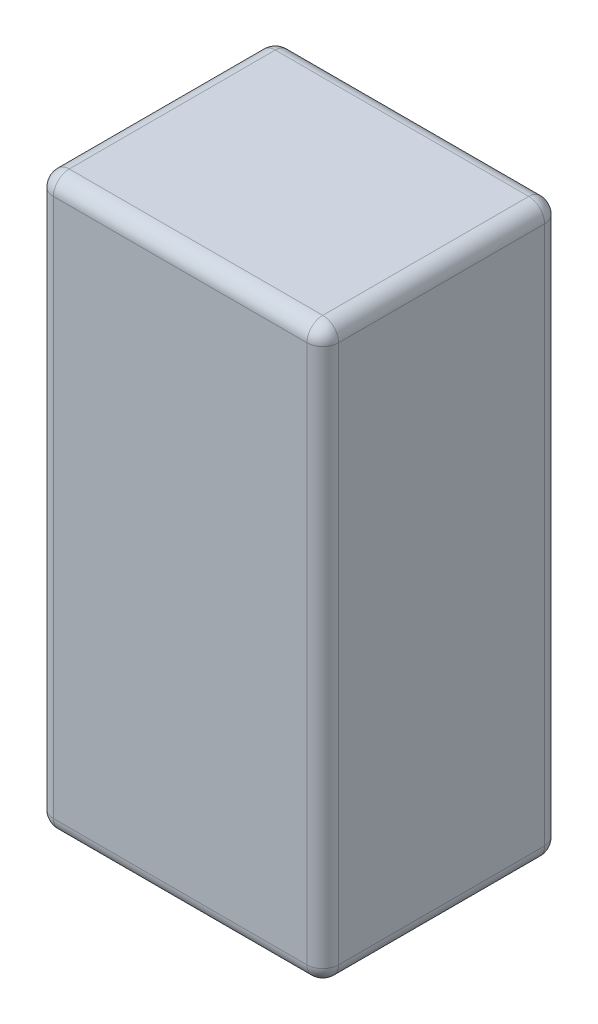
ISO-10303-21;
HEADER;
FILE_DESCRIPTION(('STEP AP214'),'2;1');
FILE_NAME('part.step','',(''),(''),'','','');
FILE_SCHEMA(('AUTOMOTIVE_DESIGN { 1 0 10303 214 1 1 1 1 }'));
ENDSEC;
DATA;
#1=APPLICATION_CONTEXT('core data for automotive mechanical design processes');
#2=APPLICATION_PROTOCOL_DEFINITION('international standard','automotive_design',2000,#1);
#3=PRODUCT_CONTEXT('',#1,'mechanical');
#4=PRODUCT('Part','Part','',(#3));
#5=PRODUCT_RELATED_PRODUCT_CATEGORY('part','',(#4));
#6=PRODUCT_DEFINITION_FORMATION('','',#4);
#7=PRODUCT_DEFINITION_CONTEXT('part definition',#1,'design');
#8=PRODUCT_DEFINITION('design','',#6,#7);
#9=PRODUCT_DEFINITION_SHAPE('','',#8);
#10=(LENGTH_UNIT() NAMED_UNIT(*) SI_UNIT(.MILLI.,.METRE.));
#11=(NAMED_UNIT(*) PLANE_ANGLE_UNIT() SI_UNIT($,.RADIAN.));
#12=(NAMED_UNIT(*) SI_UNIT($,.STERADIAN.) SOLID_ANGLE_UNIT());
#13=UNCERTAINTY_MEASURE_WITH_UNIT(LENGTH_MEASURE(1.E-05),#10,'distance_accuracy_value','');
#14=(GEOMETRIC_REPRESENTATION_CONTEXT(3) GLOBAL_UNCERTAINTY_ASSIGNED_CONTEXT((#13)) GLOBAL_UNIT_ASSIGNED_CONTEXT((#10,
#11,#12)) REPRESENTATION_CONTEXT('',''));
#15=CARTESIAN_POINT('',(0.,0.,0.));
#16=DIRECTION('',(0.,0.,1.));
#17=DIRECTION('',(1.,0.,0.));
#18=AXIS2_PLACEMENT_3D('',#15,#16,#17);
#19=CARTESIAN_POINT('',(-18.,72.,15.));
#20=DIRECTION('',(1.,0.,0.));
#21=DIRECTION('',(0.,0.,-1.));
#22=AXIS2_PLACEMENT_3D('',#19,#20,#21);
#23=PLANE('',#22);
#24=DIRECTION('',(0.,-1.,0.));
#25=VECTOR('',#24,1.);
#26=CARTESIAN_POINT('',(-18.,72.,-13.));
#27=LINE('',#26,#25);
#28=CARTESIAN_POINT('',(-18.,70.,-13.));
#29=VERTEX_POINT('',#28);
#30=CARTESIAN_POINT('',(-18.,2.,-13.));
#31=VERTEX_POINT('',#30);
#32=EDGE_CURVE('E135',#29,#31,#27,.T.);
#33=ORIENTED_EDGE('',*,*,#32,.T.);
#34=DIRECTION('',(0.,0.,1.));
#35=VECTOR('',#34,1.);
#36=CARTESIAN_POINT('',(-18.,2.,15.));
#37=LINE('',#36,#35);
#38=CARTESIAN_POINT('',(-18.,2.,13.));
#39=VERTEX_POINT('',#38);
#40=EDGE_CURVE('E131',#31,#39,#37,.T.);
#41=ORIENTED_EDGE('',*,*,#40,.T.);
#42=DIRECTION('',(0.,-1.,0.));
#43=VECTOR('',#42,1.);
#44=CARTESIAN_POINT('',(-18.,72.,13.));
#45=LINE('',#44,#43);
#46=CARTESIAN_POINT('',(-18.,70.,13.));
#47=VERTEX_POINT('',#46);
#48=EDGE_CURVE('E126',#39,#47,#45,.F.);
#49=ORIENTED_EDGE('',*,*,#48,.T.);
#50=DIRECTION('',(0.,0.,1.));
#51=VECTOR('',#50,1.);
#52=CARTESIAN_POINT('',(-18.,70.,-15.));
#53=LINE('',#52,#51);
#54=EDGE_CURVE('E128',#47,#29,#53,.F.);
#55=ORIENTED_EDGE('',*,*,#54,.T.);
#56=EDGE_LOOP('',(#33,#41,#49,#55));
#57=FACE_BOUND('',#56,.T.);
#58=ADVANCED_FACE('F38',(#57),#23,.F.);
#59=CARTESIAN_POINT('',(18.,72.,15.));
#60=DIRECTION('',(0.,0.,-1.));
#61=DIRECTION('',(-1.,0.,0.));
#62=AXIS2_PLACEMENT_3D('',#59,#60,#61);
#63=PLANE('',#62);
#64=DIRECTION('',(0.,-1.,0.));
#65=VECTOR('',#64,1.);
#66=CARTESIAN_POINT('',(-16.,72.,15.));
#67=LINE('',#66,#65);
#68=CARTESIAN_POINT('',(-16.,70.,15.));
#69=VERTEX_POINT('',#68);
#70=CARTESIAN_POINT('',(-16.,2.,15.));
#71=VERTEX_POINT('',#70);
#72=EDGE_CURVE('E157',#69,#71,#67,.T.);
#73=ORIENTED_EDGE('',*,*,#72,.T.);
#74=DIRECTION('',(1.,0.,0.));
#75=VECTOR('',#74,1.);
#76=CARTESIAN_POINT('',(18.,2.,15.));
#77=LINE('',#76,#75);
#78=CARTESIAN_POINT('',(16.,2.,15.));
#79=VERTEX_POINT('',#78);
#80=EDGE_CURVE('E235',#71,#79,#77,.T.);
#81=ORIENTED_EDGE('',*,*,#80,.T.);
#82=DIRECTION('',(0.,-1.,0.));
#83=VECTOR('',#82,1.);
#84=CARTESIAN_POINT('',(16.,72.,15.));
#85=LINE('',#84,#83);
#86=CARTESIAN_POINT('',(16.,70.,15.));
#87=VERTEX_POINT('',#86);
#88=EDGE_CURVE('E228',#79,#87,#85,.F.);
#89=ORIENTED_EDGE('',*,*,#88,.T.);
#90=DIRECTION('',(1.,0.,0.));
#91=VECTOR('',#90,1.);
#92=CARTESIAN_POINT('',(-18.,70.,15.));
#93=LINE('',#92,#91);
#94=EDGE_CURVE('E226',#87,#69,#93,.F.);
#95=ORIENTED_EDGE('',*,*,#94,.T.);
#96=EDGE_LOOP('',(#73,#81,#89,#95));
#97=FACE_BOUND('',#96,.T.);
#98=ADVANCED_FACE('F325',(#97),#63,.F.);
#99=CARTESIAN_POINT('',(18.,72.,15.));
#100=DIRECTION('',(-1.,0.,0.));
#101=DIRECTION('',(0.,0.,1.));
#102=AXIS2_PLACEMENT_3D('',#99,#100,#101);
#103=PLANE('',#102);
#104=DIRECTION('',(0.,0.,-1.));
#105=VECTOR('',#104,1.);
#106=CARTESIAN_POINT('',(18.,2.,15.));
#107=LINE('',#106,#105);
#108=CARTESIAN_POINT('',(18.,2.,13.));
#109=VERTEX_POINT('',#108);
#110=CARTESIAN_POINT('',(18.,2.,-13.));
#111=VERTEX_POINT('',#110);
#112=EDGE_CURVE('E222',#109,#111,#107,.T.);
#113=ORIENTED_EDGE('',*,*,#112,.T.);
#114=DIRECTION('',(0.,-1.,0.));
#115=VECTOR('',#114,1.);
#116=CARTESIAN_POINT('',(18.,72.,-13.));
#117=LINE('',#116,#115);
#118=CARTESIAN_POINT('',(18.,70.,-13.));
#119=VERTEX_POINT('',#118);
#120=EDGE_CURVE('E219',#111,#119,#117,.F.);
#121=ORIENTED_EDGE('',*,*,#120,.T.);
#122=DIRECTION('',(0.,0.,-1.));
#123=VECTOR('',#122,1.);
#124=CARTESIAN_POINT('',(18.,70.,15.));
#125=LINE('',#124,#123);
#126=CARTESIAN_POINT('',(18.,70.,13.));
#127=VERTEX_POINT('',#126);
#128=EDGE_CURVE('E212',#119,#127,#125,.F.);
#129=ORIENTED_EDGE('',*,*,#128,.T.);
#130=DIRECTION('',(0.,-1.,0.));
#131=VECTOR('',#130,1.);
#132=CARTESIAN_POINT('',(18.,72.,13.));
#133=LINE('',#132,#131);
#134=EDGE_CURVE('E215',#127,#109,#133,.T.);
#135=ORIENTED_EDGE('',*,*,#134,.T.);
#136=EDGE_LOOP('',(#113,#121,#129,#135));
#137=FACE_BOUND('',#136,.T.);
#138=ADVANCED_FACE('F220',(#137),#103,.F.);
#139=CARTESIAN_POINT('',(18.,72.,-15.));
#140=DIRECTION('',(0.,0.,1.));
#141=DIRECTION('',(1.,0.,0.));
#142=AXIS2_PLACEMENT_3D('',#139,#140,#141);
#143=PLANE('',#142);
#144=DIRECTION('',(-1.,0.,0.));
#145=VECTOR('',#144,1.);
#146=CARTESIAN_POINT('',(18.,2.,-15.));
#147=LINE('',#146,#145);
#148=CARTESIAN_POINT('',(16.,2.,-15.));
#149=VERTEX_POINT('',#148);
#150=CARTESIAN_POINT('',(-16.,2.,-15.));
#151=VERTEX_POINT('',#150);
#152=EDGE_CURVE('E284',#149,#151,#147,.T.);
#153=ORIENTED_EDGE('',*,*,#152,.T.);
#154=DIRECTION('',(0.,-1.,0.));
#155=VECTOR('',#154,1.);
#156=CARTESIAN_POINT('',(-16.,72.,-15.));
#157=LINE('',#156,#155);
#158=CARTESIAN_POINT('',(-16.,70.,-15.));
#159=VERTEX_POINT('',#158);
#160=EDGE_CURVE('E216',#151,#159,#157,.F.);
#161=ORIENTED_EDGE('',*,*,#160,.T.);
#162=DIRECTION('',(-1.,0.,0.));
#163=VECTOR('',#162,1.);
#164=CARTESIAN_POINT('',(18.,70.,-15.));
#165=LINE('',#164,#163);
#166=CARTESIAN_POINT('',(16.,70.,-15.));
#167=VERTEX_POINT('',#166);
#168=EDGE_CURVE('E277',#159,#167,#165,.F.);
#169=ORIENTED_EDGE('',*,*,#168,.T.);
#170=DIRECTION('',(0.,-1.,0.));
#171=VECTOR('',#170,1.);
#172=CARTESIAN_POINT('',(16.,72.,-15.));
#173=LINE('',#172,#171);
#174=EDGE_CURVE('E279',#167,#149,#173,.T.);
#175=ORIENTED_EDGE('',*,*,#174,.T.);
#176=EDGE_LOOP('',(#153,#161,#169,#175));
#177=FACE_BOUND('',#176,.T.);
#178=ADVANCED_FACE('F309',(#177),#143,.F.);
#179=CARTESIAN_POINT('',(0.,72.,0.));
#180=DIRECTION('',(0.,1.,0.));
#181=DIRECTION('',(0.,0.,1.));
#182=AXIS2_PLACEMENT_3D('',#179,#180,#181);
#183=PLANE('',#182);
#184=DIRECTION('',(0.,0.,-1.));
#185=VECTOR('',#184,1.);
#186=CARTESIAN_POINT('',(16.,72.,-15.));
#187=LINE('',#186,#185);
#188=CARTESIAN_POINT('',(16.,72.,13.));
#189=VERTEX_POINT('',#188);
#190=CARTESIAN_POINT('',(16.,72.,-13.));
#191=VERTEX_POINT('',#190);
#192=EDGE_CURVE('E47',#189,#191,#187,.T.);
#193=ORIENTED_EDGE('',*,*,#192,.T.);
#194=DIRECTION('',(-1.,0.,0.));
#195=VECTOR('',#194,1.);
#196=CARTESIAN_POINT('',(-18.,72.,-13.));
#197=LINE('',#196,#195);
#198=CARTESIAN_POINT('',(-16.,72.,-13.));
#199=VERTEX_POINT('',#198);
#200=EDGE_CURVE('E11',#191,#199,#197,.T.);
#201=ORIENTED_EDGE('',*,*,#200,.T.);
#202=DIRECTION('',(0.,0.,1.));
#203=VECTOR('',#202,1.);
#204=CARTESIAN_POINT('',(-16.,72.,15.));
#205=LINE('',#204,#203);
#206=CARTESIAN_POINT('',(-16.,72.,13.));
#207=VERTEX_POINT('',#206);
#208=EDGE_CURVE('E237',#199,#207,#205,.T.);
#209=ORIENTED_EDGE('',*,*,#208,.T.);
#210=DIRECTION('',(1.,0.,0.));
#211=VECTOR('',#210,1.);
#212=CARTESIAN_POINT('',(18.,72.,13.));
#213=LINE('',#212,#211);
#214=EDGE_CURVE('E58',#207,#189,#213,.T.);
#215=ORIENTED_EDGE('',*,*,#214,.T.);
#216=EDGE_LOOP('',(#193,#201,#209,#215));
#217=FACE_BOUND('',#216,.T.);
#218=ADVANCED_FACE('F531',(#217),#183,.T.);
#219=CARTESIAN_POINT('',(0.,0.,0.));
#220=DIRECTION('',(0.,1.,0.));
#221=DIRECTION('',(0.,0.,1.));
#222=AXIS2_PLACEMENT_3D('',#219,#220,#221);
#223=PLANE('',#222);
#224=DIRECTION('',(1.,0.,0.));
#225=VECTOR('',#224,1.);
#226=CARTESIAN_POINT('',(0.,0.,13.));
#227=LINE('',#226,#225);
#228=CARTESIAN_POINT('',(16.,0.,13.));
#229=VERTEX_POINT('',#228);
#230=CARTESIAN_POINT('',(-16.,0.,13.));
#231=VERTEX_POINT('',#230);
#232=EDGE_CURVE('E273',#229,#231,#227,.F.);
#233=ORIENTED_EDGE('',*,*,#232,.T.);
#234=DIRECTION('',(0.,0.,1.));
#235=VECTOR('',#234,1.);
#236=CARTESIAN_POINT('',(-16.,0.,0.));
#237=LINE('',#236,#235);
#238=CARTESIAN_POINT('',(-16.,0.,-13.));
#239=VERTEX_POINT('',#238);
#240=EDGE_CURVE('E267',#231,#239,#237,.F.);
#241=ORIENTED_EDGE('',*,*,#240,.T.);
#242=DIRECTION('',(-1.,0.,0.));
#243=VECTOR('',#242,1.);
#244=CARTESIAN_POINT('',(0.,0.,-13.));
#245=LINE('',#244,#243);
#246=CARTESIAN_POINT('',(16.,0.,-13.));
#247=VERTEX_POINT('',#246);
#248=EDGE_CURVE('E261',#239,#247,#245,.F.);
#249=ORIENTED_EDGE('',*,*,#248,.T.);
#250=DIRECTION('',(0.,0.,-1.));
#251=VECTOR('',#250,1.);
#252=CARTESIAN_POINT('',(16.,0.,0.));
#253=LINE('',#252,#251);
#254=EDGE_CURVE('E268',#247,#229,#253,.F.);
#255=ORIENTED_EDGE('',*,*,#254,.T.);
#256=EDGE_LOOP('',(#233,#241,#249,#255));
#257=FACE_BOUND('',#256,.T.);
#258=ADVANCED_FACE('F271',(#257),#223,.F.);
#259=CARTESIAN_POINT('',(16.,70.,0.));
#260=DIRECTION('',(0.,0.,1.));
#261=DIRECTION('',(1.,0.,0.));
#262=AXIS2_PLACEMENT_3D('',#259,#260,#261);
#263=CYLINDRICAL_SURFACE('',#262,2.);
#264=CARTESIAN_POINT('',(16.,70.,-13.));
#265=DIRECTION('',(0.,0.,-1.));
#266=DIRECTION('',(-1.,0.,0.));
#267=AXIS2_PLACEMENT_3D('',#264,#265,#266);
#268=CIRCLE('',#267,2.);
#269=EDGE_CURVE('E42',#191,#119,#268,.T.);
#270=ORIENTED_EDGE('',*,*,#269,.F.);
#271=ORIENTED_EDGE('',*,*,#192,.F.);
#272=CARTESIAN_POINT('',(16.,70.,13.));
#273=DIRECTION('',(0.,0.,1.));
#274=DIRECTION('',(1.,0.,0.));
#275=AXIS2_PLACEMENT_3D('',#272,#273,#274);
#276=CIRCLE('',#275,2.);
#277=EDGE_CURVE('E197',#127,#189,#276,.T.);
#278=ORIENTED_EDGE('',*,*,#277,.F.);
#279=ORIENTED_EDGE('',*,*,#128,.F.);
#280=EDGE_LOOP('',(#270,#271,#278,#279));
#281=FACE_BOUND('',#280,.T.);
#282=ADVANCED_FACE('F40',(#281),#263,.T.);
#283=CARTESIAN_POINT('',(16.,70.,-13.));
#284=DIRECTION('',(0.,0.,1.));
#285=DIRECTION('',(1.,0.,0.));
#286=AXIS2_PLACEMENT_3D('',#283,#284,#285);
#287=SPHERICAL_SURFACE('',#286,2.);
#288=CARTESIAN_POINT('',(16.,70.,-13.));
#289=DIRECTION('',(1.,0.,0.));
#290=DIRECTION('',(0.,0.,-1.));
#291=AXIS2_PLACEMENT_3D('',#288,#289,#290);
#292=CIRCLE('',#291,2.);
#293=EDGE_CURVE('E193',#191,#167,#292,.F.);
#294=ORIENTED_EDGE('',*,*,#293,.F.);
#295=ORIENTED_EDGE('',*,*,#269,.T.);
#296=CARTESIAN_POINT('',(16.,70.,-13.));
#297=DIRECTION('',(0.,1.,0.));
#298=DIRECTION('',(0.,0.,1.));
#299=AXIS2_PLACEMENT_3D('',#296,#297,#298);
#300=CIRCLE('',#299,2.);
#301=EDGE_CURVE('E196',#167,#119,#300,.F.);
#302=ORIENTED_EDGE('',*,*,#301,.F.);
#303=EDGE_LOOP('',(#294,#295,#302));
#304=FACE_BOUND('',#303,.T.);
#305=ADVANCED_FACE('F208',(#304),#287,.T.);
#306=CARTESIAN_POINT('',(16.,70.,13.));
#307=DIRECTION('',(0.,0.,1.));
#308=DIRECTION('',(1.,0.,0.));
#309=AXIS2_PLACEMENT_3D('',#306,#307,#308);
#310=SPHERICAL_SURFACE('',#309,2.);
#311=CARTESIAN_POINT('',(16.,70.,13.));
#312=DIRECTION('',(0.,1.,0.));
#313=DIRECTION('',(0.,0.,1.));
#314=AXIS2_PLACEMENT_3D('',#311,#312,#313);
#315=CIRCLE('',#314,2.);
#316=EDGE_CURVE('E187',#127,#87,#315,.F.);
#317=ORIENTED_EDGE('',*,*,#316,.F.);
#318=ORIENTED_EDGE('',*,*,#277,.T.);
#319=CARTESIAN_POINT('',(16.,70.,13.));
#320=DIRECTION('',(1.,0.,0.));
#321=DIRECTION('',(0.,0.,-1.));
#322=AXIS2_PLACEMENT_3D('',#319,#320,#321);
#323=CIRCLE('',#322,2.);
#324=EDGE_CURVE('E190',#87,#189,#323,.F.);
#325=ORIENTED_EDGE('',*,*,#324,.F.);
#326=EDGE_LOOP('',(#317,#318,#325));
#327=FACE_BOUND('',#326,.T.);
#328=ADVANCED_FACE('F498',(#327),#310,.T.);
#329=CARTESIAN_POINT('',(16.,72.,-13.));
#330=DIRECTION('',(0.,-1.,0.));
#331=DIRECTION('',(0.,0.,-1.));
#332=AXIS2_PLACEMENT_3D('',#329,#330,#331);
#333=CYLINDRICAL_SURFACE('',#332,2.);
#334=ORIENTED_EDGE('',*,*,#301,.T.);
#335=ORIENTED_EDGE('',*,*,#120,.F.);
#336=CARTESIAN_POINT('',(16.,2.,-13.));
#337=DIRECTION('',(0.,-1.,0.));
#338=DIRECTION('',(0.,0.,-1.));
#339=AXIS2_PLACEMENT_3D('',#336,#337,#338);
#340=CIRCLE('',#339,2.);
#341=EDGE_CURVE('E181',#149,#111,#340,.T.);
#342=ORIENTED_EDGE('',*,*,#341,.F.);
#343=ORIENTED_EDGE('',*,*,#174,.F.);
#344=EDGE_LOOP('',(#334,#335,#342,#343));
#345=FACE_BOUND('',#344,.T.);
#346=ADVANCED_FACE('F311',(#345),#333,.T.);
#347=CARTESIAN_POINT('',(0.,70.,-13.));
#348=DIRECTION('',(1.,0.,0.));
#349=DIRECTION('',(0.,0.,-1.));
#350=AXIS2_PLACEMENT_3D('',#347,#348,#349);
#351=CYLINDRICAL_SURFACE('',#350,2.);
#352=ORIENTED_EDGE('',*,*,#293,.T.);
#353=ORIENTED_EDGE('',*,*,#168,.F.);
#354=CARTESIAN_POINT('',(-16.,70.,-13.));
#355=DIRECTION('',(-1.,0.,0.));
#356=DIRECTION('',(0.,0.,1.));
#357=AXIS2_PLACEMENT_3D('',#354,#355,#356);
#358=CIRCLE('',#357,2.);
#359=EDGE_CURVE('E178',#199,#159,#358,.T.);
#360=ORIENTED_EDGE('',*,*,#359,.F.);
#361=ORIENTED_EDGE('',*,*,#200,.F.);
#362=EDGE_LOOP('',(#352,#353,#360,#361));
#363=FACE_BOUND('',#362,.T.);
#364=ADVANCED_FACE('F476',(#363),#351,.T.);
#365=CARTESIAN_POINT('',(-16.,70.,0.));
#366=DIRECTION('',(0.,0.,-1.));
#367=DIRECTION('',(-1.,0.,0.));
#368=AXIS2_PLACEMENT_3D('',#365,#366,#367);
#369=CYLINDRICAL_SURFACE('',#368,2.);
#370=CARTESIAN_POINT('',(-16.,70.,13.));
#371=DIRECTION('',(0.,0.,1.));
#372=DIRECTION('',(1.,0.,0.));
#373=AXIS2_PLACEMENT_3D('',#370,#371,#372);
#374=CIRCLE('',#373,2.);
#375=EDGE_CURVE('E142',#207,#47,#374,.T.);
#376=ORIENTED_EDGE('',*,*,#375,.F.);
#377=ORIENTED_EDGE('',*,*,#208,.F.);
#378=CARTESIAN_POINT('',(-16.,70.,-13.));
#379=DIRECTION('',(0.,0.,-1.));
#380=DIRECTION('',(-1.,0.,0.));
#381=AXIS2_PLACEMENT_3D('',#378,#379,#380);
#382=CIRCLE('',#381,2.);
#383=EDGE_CURVE('E144',#29,#199,#382,.T.);
#384=ORIENTED_EDGE('',*,*,#383,.F.);
#385=ORIENTED_EDGE('',*,*,#54,.F.);
#386=EDGE_LOOP('',(#376,#377,#384,#385));
#387=FACE_BOUND('',#386,.T.);
#388=ADVANCED_FACE('F140',(#387),#369,.T.);
#389=CARTESIAN_POINT('',(0.,70.,13.));
#390=DIRECTION('',(-1.,0.,0.));
#391=DIRECTION('',(0.,0.,1.));
#392=AXIS2_PLACEMENT_3D('',#389,#390,#391);
#393=CYLINDRICAL_SURFACE('',#392,2.);
#394=ORIENTED_EDGE('',*,*,#324,.T.);
#395=ORIENTED_EDGE('',*,*,#214,.F.);
#396=CARTESIAN_POINT('',(-16.,70.,13.));
#397=DIRECTION('',(-1.,0.,0.));
#398=DIRECTION('',(0.,-1.,0.));
#399=AXIS2_PLACEMENT_3D('',#396,#397,#398);
#400=CIRCLE('',#399,2.);
#401=EDGE_CURVE('E153',#69,#207,#400,.T.);
#402=ORIENTED_EDGE('',*,*,#401,.F.);
#403=ORIENTED_EDGE('',*,*,#94,.F.);
#404=EDGE_LOOP('',(#394,#395,#402,#403));
#405=FACE_BOUND('',#404,.T.);
#406=ADVANCED_FACE('F457',(#405),#393,.T.);
#407=CARTESIAN_POINT('',(16.,72.,13.));
#408=DIRECTION('',(0.,-1.,0.));
#409=DIRECTION('',(0.,0.,-1.));
#410=AXIS2_PLACEMENT_3D('',#407,#408,#409);
#411=CYLINDRICAL_SURFACE('',#410,2.);
#412=ORIENTED_EDGE('',*,*,#316,.T.);
#413=ORIENTED_EDGE('',*,*,#88,.F.);
#414=CARTESIAN_POINT('',(16.,2.,13.));
#415=DIRECTION('',(0.,-1.,0.));
#416=DIRECTION('',(0.,0.,-1.));
#417=AXIS2_PLACEMENT_3D('',#414,#415,#416);
#418=CIRCLE('',#417,2.);
#419=EDGE_CURVE('E173',#109,#79,#418,.T.);
#420=ORIENTED_EDGE('',*,*,#419,.F.);
#421=ORIENTED_EDGE('',*,*,#134,.F.);
#422=EDGE_LOOP('',(#412,#413,#420,#421));
#423=FACE_BOUND('',#422,.T.);
#424=ADVANCED_FACE('F295',(#423),#411,.T.);
#425=CARTESIAN_POINT('',(16.,2.,15.));
#426=DIRECTION('',(0.,0.,-1.));
#427=DIRECTION('',(-1.,0.,0.));
#428=AXIS2_PLACEMENT_3D('',#425,#426,#427);
#429=CYLINDRICAL_SURFACE('',#428,2.);
#430=CARTESIAN_POINT('',(16.,2.,-13.));
#431=DIRECTION('',(0.,0.,-1.));
#432=DIRECTION('',(-1.,0.,0.));
#433=AXIS2_PLACEMENT_3D('',#430,#431,#432);
#434=CIRCLE('',#433,2.);
#435=EDGE_CURVE('E184',#111,#247,#434,.T.);
#436=ORIENTED_EDGE('',*,*,#435,.F.);
#437=ORIENTED_EDGE('',*,*,#112,.F.);
#438=CARTESIAN_POINT('',(16.,2.,13.));
#439=DIRECTION('',(0.,0.,1.));
#440=DIRECTION('',(1.,0.,0.));
#441=AXIS2_PLACEMENT_3D('',#438,#439,#440);
#442=CIRCLE('',#441,2.);
#443=EDGE_CURVE('E170',#229,#109,#442,.T.);
#444=ORIENTED_EDGE('',*,*,#443,.F.);
#445=ORIENTED_EDGE('',*,*,#254,.F.);
#446=EDGE_LOOP('',(#436,#437,#444,#445));
#447=FACE_BOUND('',#446,.T.);
#448=ADVANCED_FACE('F292',(#447),#429,.T.);
#449=CARTESIAN_POINT('',(16.,2.,-13.));
#450=DIRECTION('',(0.,0.,1.));
#451=DIRECTION('',(1.,0.,0.));
#452=AXIS2_PLACEMENT_3D('',#449,#450,#451);
#453=SPHERICAL_SURFACE('',#452,2.);
#454=ORIENTED_EDGE('',*,*,#341,.T.);
#455=ORIENTED_EDGE('',*,*,#435,.T.);
#456=CARTESIAN_POINT('',(16.,2.,-13.));
#457=DIRECTION('',(1.,0.,0.));
#458=DIRECTION('',(0.,0.,-1.));
#459=AXIS2_PLACEMENT_3D('',#456,#457,#458);
#460=CIRCLE('',#459,2.);
#461=EDGE_CURVE('E161',#149,#247,#460,.F.);
#462=ORIENTED_EDGE('',*,*,#461,.F.);
#463=EDGE_LOOP('',(#454,#455,#462));
#464=FACE_BOUND('',#463,.T.);
#465=ADVANCED_FACE('F313',(#464),#453,.T.);
#466=CARTESIAN_POINT('',(-16.,70.,-13.));
#467=DIRECTION('',(0.,0.,1.));
#468=DIRECTION('',(1.,0.,0.));
#469=AXIS2_PLACEMENT_3D('',#466,#467,#468);
#470=SPHERICAL_SURFACE('',#469,2.);
#471=ORIENTED_EDGE('',*,*,#383,.T.);
#472=ORIENTED_EDGE('',*,*,#359,.T.);
#473=CARTESIAN_POINT('',(-16.,70.,-13.));
#474=DIRECTION('',(0.,1.,0.));
#475=DIRECTION('',(0.,0.,1.));
#476=AXIS2_PLACEMENT_3D('',#473,#474,#475);
#477=CIRCLE('',#476,2.);
#478=EDGE_CURVE('E158',#29,#159,#477,.F.);
#479=ORIENTED_EDGE('',*,*,#478,.F.);
#480=EDGE_LOOP('',(#471,#472,#479));
#481=FACE_BOUND('',#480,.T.);
#482=ADVANCED_FACE('F315',(#481),#470,.T.);
#483=CARTESIAN_POINT('',(-16.,70.,13.));
#484=DIRECTION('',(0.,0.,1.));
#485=DIRECTION('',(1.,0.,0.));
#486=AXIS2_PLACEMENT_3D('',#483,#484,#485);
#487=SPHERICAL_SURFACE('',#486,2.);
#488=ORIENTED_EDGE('',*,*,#401,.T.);
#489=ORIENTED_EDGE('',*,*,#375,.T.);
#490=CARTESIAN_POINT('',(-16.,70.,13.));
#491=DIRECTION('',(0.,1.,0.));
#492=DIRECTION('',(0.,0.,1.));
#493=AXIS2_PLACEMENT_3D('',#490,#491,#492);
#494=CIRCLE('',#493,2.);
#495=EDGE_CURVE('E150',#69,#47,#494,.F.);
#496=ORIENTED_EDGE('',*,*,#495,.F.);
#497=EDGE_LOOP('',(#488,#489,#496));
#498=FACE_BOUND('',#497,.T.);
#499=ADVANCED_FACE('F149',(#498),#487,.T.);
#500=CARTESIAN_POINT('',(16.,2.,13.));
#501=DIRECTION('',(0.,0.,1.));
#502=DIRECTION('',(1.,0.,0.));
#503=AXIS2_PLACEMENT_3D('',#500,#501,#502);
#504=SPHERICAL_SURFACE('',#503,2.);
#505=ORIENTED_EDGE('',*,*,#443,.T.);
#506=ORIENTED_EDGE('',*,*,#419,.T.);
#507=CARTESIAN_POINT('',(16.,2.,13.));
#508=DIRECTION('',(1.,0.,0.));
#509=DIRECTION('',(0.,0.,-1.));
#510=AXIS2_PLACEMENT_3D('',#507,#508,#509);
#511=CIRCLE('',#510,2.);
#512=EDGE_CURVE('E159',#229,#79,#511,.F.);
#513=ORIENTED_EDGE('',*,*,#512,.F.);
#514=EDGE_LOOP('',(#505,#506,#513));
#515=FACE_BOUND('',#514,.T.);
#516=ADVANCED_FACE('F297',(#515),#504,.T.);
#517=CARTESIAN_POINT('',(18.,2.,-13.));
#518=DIRECTION('',(-1.,0.,0.));
#519=DIRECTION('',(0.,0.,1.));
#520=AXIS2_PLACEMENT_3D('',#517,#518,#519);
#521=CYLINDRICAL_SURFACE('',#520,2.);
#522=ORIENTED_EDGE('',*,*,#461,.T.);
#523=ORIENTED_EDGE('',*,*,#248,.F.);
#524=CARTESIAN_POINT('',(-16.,2.,-13.));
#525=DIRECTION('',(-1.,0.,0.));
#526=DIRECTION('',(0.,0.,1.));
#527=AXIS2_PLACEMENT_3D('',#524,#525,#526);
#528=CIRCLE('',#527,2.);
#529=EDGE_CURVE('E164',#151,#239,#528,.T.);
#530=ORIENTED_EDGE('',*,*,#529,.F.);
#531=ORIENTED_EDGE('',*,*,#152,.F.);
#532=EDGE_LOOP('',(#522,#523,#530,#531));
#533=FACE_BOUND('',#532,.T.);
#534=ADVANCED_FACE('F263',(#533),#521,.T.);
#535=CARTESIAN_POINT('',(-16.,72.,-13.));
#536=DIRECTION('',(0.,-1.,0.));
#537=DIRECTION('',(0.,0.,-1.));
#538=AXIS2_PLACEMENT_3D('',#535,#536,#537);
#539=CYLINDRICAL_SURFACE('',#538,2.);
#540=ORIENTED_EDGE('',*,*,#478,.T.);
#541=ORIENTED_EDGE('',*,*,#160,.F.);
#542=CARTESIAN_POINT('',(-16.,2.,-13.));
#543=DIRECTION('',(0.,-1.,0.));
#544=DIRECTION('',(0.,0.,-1.));
#545=AXIS2_PLACEMENT_3D('',#542,#543,#544);
#546=CIRCLE('',#545,2.);
#547=EDGE_CURVE('E250',#31,#151,#546,.T.);
#548=ORIENTED_EDGE('',*,*,#547,.F.);
#549=ORIENTED_EDGE('',*,*,#32,.F.);
#550=EDGE_LOOP('',(#540,#541,#548,#549));
#551=FACE_BOUND('',#550,.T.);
#552=ADVANCED_FACE('F307',(#551),#539,.T.);
#553=CARTESIAN_POINT('',(-16.,72.,13.));
#554=DIRECTION('',(0.,-1.,0.));
#555=DIRECTION('',(0.,0.,-1.));
#556=AXIS2_PLACEMENT_3D('',#553,#554,#555);
#557=CYLINDRICAL_SURFACE('',#556,2.);
#558=ORIENTED_EDGE('',*,*,#495,.T.);
#559=ORIENTED_EDGE('',*,*,#48,.F.);
#560=CARTESIAN_POINT('',(-16.,2.,13.));
#561=DIRECTION('',(0.,-1.,0.));
#562=DIRECTION('',(0.,0.,-1.));
#563=AXIS2_PLACEMENT_3D('',#560,#561,#562);
#564=CIRCLE('',#563,2.);
#565=EDGE_CURVE('E247',#71,#39,#564,.T.);
#566=ORIENTED_EDGE('',*,*,#565,.F.);
#567=ORIENTED_EDGE('',*,*,#72,.F.);
#568=EDGE_LOOP('',(#558,#559,#566,#567));
#569=FACE_BOUND('',#568,.T.);
#570=ADVANCED_FACE('F155',(#569),#557,.T.);
#571=CARTESIAN_POINT('',(18.,2.,13.));
#572=DIRECTION('',(1.,0.,0.));
#573=DIRECTION('',(0.,0.,-1.));
#574=AXIS2_PLACEMENT_3D('',#571,#572,#573);
#575=CYLINDRICAL_SURFACE('',#574,2.);
#576=ORIENTED_EDGE('',*,*,#512,.T.);
#577=ORIENTED_EDGE('',*,*,#80,.F.);
#578=CARTESIAN_POINT('',(-16.,2.,13.));
#579=DIRECTION('',(-1.,0.,0.));
#580=DIRECTION('',(0.,0.,1.));
#581=AXIS2_PLACEMENT_3D('',#578,#579,#580);
#582=CIRCLE('',#581,2.);
#583=EDGE_CURVE('E245',#231,#71,#582,.T.);
#584=ORIENTED_EDGE('',*,*,#583,.F.);
#585=ORIENTED_EDGE('',*,*,#232,.F.);
#586=EDGE_LOOP('',(#576,#577,#584,#585));
#587=FACE_BOUND('',#586,.T.);
#588=ADVANCED_FACE('F300',(#587),#575,.T.);
#589=CARTESIAN_POINT('',(-16.,2.,-13.));
#590=DIRECTION('',(0.,0.,1.));
#591=DIRECTION('',(1.,0.,0.));
#592=AXIS2_PLACEMENT_3D('',#589,#590,#591);
#593=SPHERICAL_SURFACE('',#592,2.);
#594=ORIENTED_EDGE('',*,*,#547,.T.);
#595=ORIENTED_EDGE('',*,*,#529,.T.);
#596=CARTESIAN_POINT('',(-16.,2.,-13.));
#597=DIRECTION('',(0.,0.,-1.));
#598=DIRECTION('',(-1.,0.,0.));
#599=AXIS2_PLACEMENT_3D('',#596,#597,#598);
#600=CIRCLE('',#599,2.);
#601=EDGE_CURVE('E243',#31,#239,#600,.F.);
#602=ORIENTED_EDGE('',*,*,#601,.F.);
#603=EDGE_LOOP('',(#594,#595,#602));
#604=FACE_BOUND('',#603,.T.);
#605=ADVANCED_FACE('F257',(#604),#593,.T.);
#606=CARTESIAN_POINT('',(-16.,2.,13.));
#607=DIRECTION('',(0.,0.,1.));
#608=DIRECTION('',(1.,0.,0.));
#609=AXIS2_PLACEMENT_3D('',#606,#607,#608);
#610=SPHERICAL_SURFACE('',#609,2.);
#611=ORIENTED_EDGE('',*,*,#583,.T.);
#612=ORIENTED_EDGE('',*,*,#565,.T.);
#613=CARTESIAN_POINT('',(-16.,2.,13.));
#614=DIRECTION('',(0.,0.,1.));
#615=DIRECTION('',(1.,0.,0.));
#616=AXIS2_PLACEMENT_3D('',#613,#614,#615);
#617=CIRCLE('',#616,2.);
#618=EDGE_CURVE('E241',#231,#39,#617,.F.);
#619=ORIENTED_EDGE('',*,*,#618,.F.);
#620=EDGE_LOOP('',(#611,#612,#619));
#621=FACE_BOUND('',#620,.T.);
#622=ADVANCED_FACE('F337',(#621),#610,.T.);
#623=CARTESIAN_POINT('',(-16.,2.,15.));
#624=DIRECTION('',(0.,0.,1.));
#625=DIRECTION('',(1.,0.,0.));
#626=AXIS2_PLACEMENT_3D('',#623,#624,#625);
#627=CYLINDRICAL_SURFACE('',#626,2.);
#628=ORIENTED_EDGE('',*,*,#601,.T.);
#629=ORIENTED_EDGE('',*,*,#240,.F.);
#630=ORIENTED_EDGE('',*,*,#618,.T.);
#631=ORIENTED_EDGE('',*,*,#40,.F.);
#632=EDGE_LOOP('',(#628,#629,#630,#631));
#633=FACE_BOUND('',#632,.T.);
#634=ADVANCED_FACE('F334',(#633),#627,.T.);
#635=CLOSED_SHELL('',(#58,#98,#138,#178,#218,#258,#282,#305,#328,#346,#364,#388,#406,#424,#448,
#465,#482,#499,#516,#534,#552,#570,#588,#605,#622,#634));
#636=MANIFOLD_SOLID_BREP('B2',#635);
#637=ADVANCED_BREP_SHAPE_REPRESENTATION('',(#18,#636),#14);
#638=SHAPE_DEFINITION_REPRESENTATION(#9,#637);
ENDSEC;
END-ISO-10303-21;
